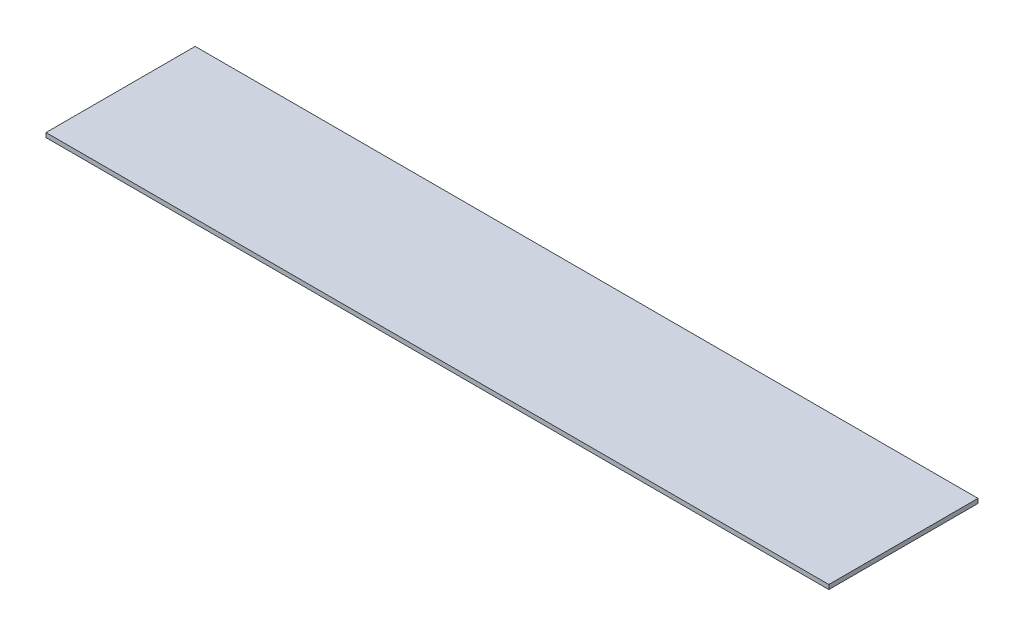
ISO-10303-21;
HEADER;
FILE_DESCRIPTION(('STEP AP214'),'2;1');
FILE_NAME('part.step','',(''),(''),'','','');
FILE_SCHEMA(('AUTOMOTIVE_DESIGN { 1 0 10303 214 1 1 1 1 }'));
ENDSEC;
DATA;
#1=APPLICATION_CONTEXT('core data for automotive mechanical design processes');
#2=APPLICATION_PROTOCOL_DEFINITION('international standard','automotive_design',2000,#1);
#3=PRODUCT_CONTEXT('',#1,'mechanical');
#4=PRODUCT('Part','Part','',(#3));
#5=PRODUCT_RELATED_PRODUCT_CATEGORY('part','',(#4));
#6=PRODUCT_DEFINITION_FORMATION('','',#4);
#7=PRODUCT_DEFINITION_CONTEXT('part definition',#1,'design');
#8=PRODUCT_DEFINITION('design','',#6,#7);
#9=PRODUCT_DEFINITION_SHAPE('','',#8);
#10=(LENGTH_UNIT() NAMED_UNIT(*) SI_UNIT(.MILLI.,.METRE.));
#11=(NAMED_UNIT(*) PLANE_ANGLE_UNIT() SI_UNIT($,.RADIAN.));
#12=(NAMED_UNIT(*) SI_UNIT($,.STERADIAN.) SOLID_ANGLE_UNIT());
#13=UNCERTAINTY_MEASURE_WITH_UNIT(LENGTH_MEASURE(1.E-05),#10,'distance_accuracy_value','');
#14=(GEOMETRIC_REPRESENTATION_CONTEXT(3) GLOBAL_UNCERTAINTY_ASSIGNED_CONTEXT((#13)) GLOBAL_UNIT_ASSIGNED_CONTEXT((#10,
#11,#12)) REPRESENTATION_CONTEXT('',''));
#15=CARTESIAN_POINT('',(0.,0.,0.));
#16=DIRECTION('',(0.,0.,1.));
#17=DIRECTION('',(1.,0.,0.));
#18=AXIS2_PLACEMENT_3D('',#15,#16,#17);
#19=CARTESIAN_POINT('',(-265.,3.,50.5));
#20=DIRECTION('',(1.,0.,0.));
#21=DIRECTION('',(0.,0.,-1.));
#22=AXIS2_PLACEMENT_3D('',#19,#20,#21);
#23=PLANE('',#22);
#24=DIRECTION('',(0.,0.,1.));
#25=VECTOR('',#24,1.);
#26=CARTESIAN_POINT('',(-265.,0.,50.5));
#27=LINE('',#26,#25);
#28=CARTESIAN_POINT('',(-265.,0.,-50.5));
#29=VERTEX_POINT('',#28);
#30=CARTESIAN_POINT('',(-265.,0.,50.5));
#31=VERTEX_POINT('',#30);
#32=EDGE_CURVE('E97',#29,#31,#27,.T.);
#33=ORIENTED_EDGE('',*,*,#32,.T.);
#34=DIRECTION('',(0.,-1.,0.));
#35=VECTOR('',#34,1.);
#36=CARTESIAN_POINT('',(-265.,3.,50.5));
#37=LINE('',#36,#35);
#38=CARTESIAN_POINT('',(-265.,3.,50.5));
#39=VERTEX_POINT('',#38);
#40=EDGE_CURVE('E11',#39,#31,#37,.T.);
#41=ORIENTED_EDGE('',*,*,#40,.F.);
#42=DIRECTION('',(0.,0.,1.));
#43=VECTOR('',#42,1.);
#44=CARTESIAN_POINT('',(-265.,3.,50.5));
#45=LINE('',#44,#43);
#46=CARTESIAN_POINT('',(-265.,3.,-50.5));
#47=VERTEX_POINT('',#46);
#48=EDGE_CURVE('E85',#47,#39,#45,.T.);
#49=ORIENTED_EDGE('',*,*,#48,.F.);
#50=DIRECTION('',(0.,-1.,0.));
#51=VECTOR('',#50,1.);
#52=CARTESIAN_POINT('',(-265.,3.,-50.5));
#53=LINE('',#52,#51);
#54=EDGE_CURVE('E93',#47,#29,#53,.T.);
#55=ORIENTED_EDGE('',*,*,#54,.T.);
#56=EDGE_LOOP('',(#33,#41,#49,#55));
#57=FACE_BOUND('',#56,.T.);
#58=ADVANCED_FACE('F34',(#57),#23,.F.);
#59=CARTESIAN_POINT('',(265.,3.,50.5));
#60=DIRECTION('',(0.,0.,-1.));
#61=DIRECTION('',(-1.,0.,0.));
#62=AXIS2_PLACEMENT_3D('',#59,#60,#61);
#63=PLANE('',#62);
#64=DIRECTION('',(1.,0.,0.));
#65=VECTOR('',#64,1.);
#66=CARTESIAN_POINT('',(265.,0.,50.5));
#67=LINE('',#66,#65);
#68=CARTESIAN_POINT('',(265.,0.,50.5));
#69=VERTEX_POINT('',#68);
#70=EDGE_CURVE('E89',#31,#69,#67,.T.);
#71=ORIENTED_EDGE('',*,*,#70,.T.);
#72=DIRECTION('',(0.,-1.,0.));
#73=VECTOR('',#72,1.);
#74=CARTESIAN_POINT('',(265.,3.,50.5));
#75=LINE('',#74,#73);
#76=CARTESIAN_POINT('',(265.,3.,50.5));
#77=VERTEX_POINT('',#76);
#78=EDGE_CURVE('E42',#77,#69,#75,.T.);
#79=ORIENTED_EDGE('',*,*,#78,.F.);
#80=DIRECTION('',(1.,0.,0.));
#81=VECTOR('',#80,1.);
#82=CARTESIAN_POINT('',(265.,3.,50.5));
#83=LINE('',#82,#81);
#84=EDGE_CURVE('E80',#39,#77,#83,.T.);
#85=ORIENTED_EDGE('',*,*,#84,.F.);
#86=ORIENTED_EDGE('',*,*,#40,.T.);
#87=EDGE_LOOP('',(#71,#79,#85,#86));
#88=FACE_BOUND('',#87,.T.);
#89=ADVANCED_FACE('F88',(#88),#63,.F.);
#90=CARTESIAN_POINT('',(265.,3.,50.5));
#91=DIRECTION('',(-1.,0.,0.));
#92=DIRECTION('',(0.,0.,1.));
#93=AXIS2_PLACEMENT_3D('',#90,#91,#92);
#94=PLANE('',#93);
#95=DIRECTION('',(0.,0.,-1.));
#96=VECTOR('',#95,1.);
#97=CARTESIAN_POINT('',(265.,0.,50.5));
#98=LINE('',#97,#96);
#99=CARTESIAN_POINT('',(265.,0.,-50.5));
#100=VERTEX_POINT('',#99);
#101=EDGE_CURVE('E67',#69,#100,#98,.T.);
#102=ORIENTED_EDGE('',*,*,#101,.T.);
#103=DIRECTION('',(0.,-1.,0.));
#104=VECTOR('',#103,1.);
#105=CARTESIAN_POINT('',(265.,3.,-50.5));
#106=LINE('',#105,#104);
#107=CARTESIAN_POINT('',(265.,3.,-50.5));
#108=VERTEX_POINT('',#107);
#109=EDGE_CURVE('E90',#108,#100,#106,.T.);
#110=ORIENTED_EDGE('',*,*,#109,.F.);
#111=DIRECTION('',(0.,0.,-1.));
#112=VECTOR('',#111,1.);
#113=CARTESIAN_POINT('',(265.,3.,50.5));
#114=LINE('',#113,#112);
#115=EDGE_CURVE('E83',#77,#108,#114,.T.);
#116=ORIENTED_EDGE('',*,*,#115,.F.);
#117=ORIENTED_EDGE('',*,*,#78,.T.);
#118=EDGE_LOOP('',(#102,#110,#116,#117));
#119=FACE_BOUND('',#118,.T.);
#120=ADVANCED_FACE('F91',(#119),#94,.F.);
#121=CARTESIAN_POINT('',(265.,3.,-50.5));
#122=DIRECTION('',(0.,0.,1.));
#123=DIRECTION('',(1.,0.,0.));
#124=AXIS2_PLACEMENT_3D('',#121,#122,#123);
#125=PLANE('',#124);
#126=DIRECTION('',(-1.,0.,0.));
#127=VECTOR('',#126,1.);
#128=CARTESIAN_POINT('',(265.,0.,-50.5));
#129=LINE('',#128,#127);
#130=EDGE_CURVE('E73',#100,#29,#129,.T.);
#131=ORIENTED_EDGE('',*,*,#130,.T.);
#132=ORIENTED_EDGE('',*,*,#54,.F.);
#133=DIRECTION('',(-1.,0.,0.));
#134=VECTOR('',#133,1.);
#135=CARTESIAN_POINT('',(265.,3.,-50.5));
#136=LINE('',#135,#134);
#137=EDGE_CURVE('E50',#108,#47,#136,.T.);
#138=ORIENTED_EDGE('',*,*,#137,.F.);
#139=ORIENTED_EDGE('',*,*,#109,.T.);
#140=EDGE_LOOP('',(#131,#132,#138,#139));
#141=FACE_BOUND('',#140,.T.);
#142=ADVANCED_FACE('F104',(#141),#125,.F.);
#143=CARTESIAN_POINT('',(0.,3.,0.));
#144=DIRECTION('',(0.,1.,0.));
#145=DIRECTION('',(0.,0.,1.));
#146=AXIS2_PLACEMENT_3D('',#143,#144,#145);
#147=PLANE('',#146);
#148=ORIENTED_EDGE('',*,*,#48,.T.);
#149=ORIENTED_EDGE('',*,*,#84,.T.);
#150=ORIENTED_EDGE('',*,*,#115,.T.);
#151=ORIENTED_EDGE('',*,*,#137,.T.);
#152=EDGE_LOOP('',(#148,#149,#150,#151));
#153=FACE_BOUND('',#152,.T.);
#154=ADVANCED_FACE('F81',(#153),#147,.T.);
#155=CARTESIAN_POINT('',(0.,0.,0.));
#156=DIRECTION('',(0.,1.,0.));
#157=DIRECTION('',(0.,0.,1.));
#158=AXIS2_PLACEMENT_3D('',#155,#156,#157);
#159=PLANE('',#158);
#160=ORIENTED_EDGE('',*,*,#32,.F.);
#161=ORIENTED_EDGE('',*,*,#130,.F.);
#162=ORIENTED_EDGE('',*,*,#101,.F.);
#163=ORIENTED_EDGE('',*,*,#70,.F.);
#164=EDGE_LOOP('',(#160,#161,#162,#163));
#165=FACE_BOUND('',#164,.T.);
#166=ADVANCED_FACE('F107',(#165),#159,.F.);
#167=CLOSED_SHELL('',(#58,#89,#120,#142,#154,#166));
#168=MANIFOLD_SOLID_BREP('B2',#167);
#169=ADVANCED_BREP_SHAPE_REPRESENTATION('',(#18,#168),#14);
#170=SHAPE_DEFINITION_REPRESENTATION(#9,#169);
ENDSEC;
END-ISO-10303-21;
